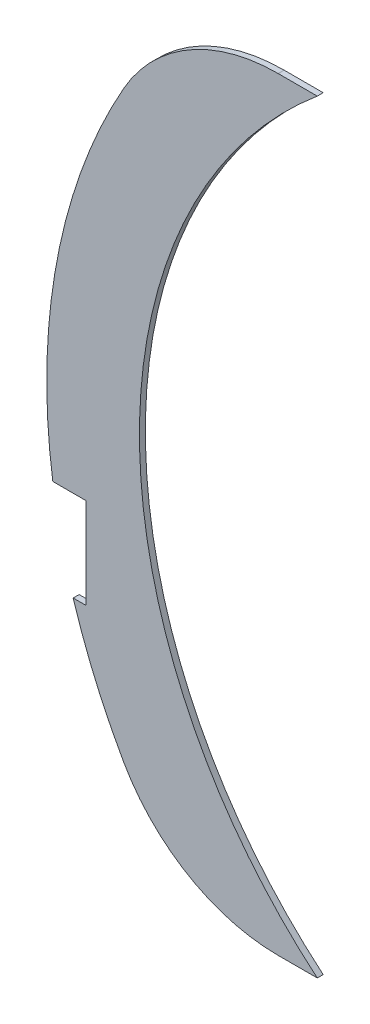
ISO-10303-21;
HEADER;
FILE_DESCRIPTION(('STEP AP214'),'2;1');
FILE_NAME('part.step','',(''),(''),'','','');
FILE_SCHEMA(('AUTOMOTIVE_DESIGN { 1 0 10303 214 1 1 1 1 }'));
ENDSEC;
DATA;
#1=APPLICATION_CONTEXT('core data for automotive mechanical design processes');
#2=APPLICATION_PROTOCOL_DEFINITION('international standard','automotive_design',2000,#1);
#3=PRODUCT_CONTEXT('',#1,'mechanical');
#4=PRODUCT('Part','Part','',(#3));
#5=PRODUCT_RELATED_PRODUCT_CATEGORY('part','',(#4));
#6=PRODUCT_DEFINITION_FORMATION('','',#4);
#7=PRODUCT_DEFINITION_CONTEXT('part definition',#1,'design');
#8=PRODUCT_DEFINITION('design','',#6,#7);
#9=PRODUCT_DEFINITION_SHAPE('','',#8);
#10=(LENGTH_UNIT() NAMED_UNIT(*) SI_UNIT(.MILLI.,.METRE.));
#11=(NAMED_UNIT(*) PLANE_ANGLE_UNIT() SI_UNIT($,.RADIAN.));
#12=(NAMED_UNIT(*) SI_UNIT($,.STERADIAN.) SOLID_ANGLE_UNIT());
#13=UNCERTAINTY_MEASURE_WITH_UNIT(LENGTH_MEASURE(1.E-05),#10,'distance_accuracy_value','');
#14=(GEOMETRIC_REPRESENTATION_CONTEXT(3) GLOBAL_UNCERTAINTY_ASSIGNED_CONTEXT((#13)) GLOBAL_UNIT_ASSIGNED_CONTEXT((#10,
#11,#12)) REPRESENTATION_CONTEXT('',''));
#15=CARTESIAN_POINT('',(0.,0.,0.));
#16=DIRECTION('',(0.,0.,1.));
#17=DIRECTION('',(1.,0.,0.));
#18=AXIS2_PLACEMENT_3D('',#15,#16,#17);
#19=CARTESIAN_POINT('',(0.,250.000000000001,-3.00000000000034));
#20=DIRECTION('',(0.,0.,0.999999999999999));
#21=DIRECTION('',(1.,0.,0.));
#22=AXIS2_PLACEMENT_3D('',#19,#20,#21);
#23=CYLINDRICAL_SURFACE('',#22,300.);
#24=DIRECTION('',(0.,0.,0.999999999999999));
#25=VECTOR('',#24,1.);
#26=CARTESIAN_POINT('',(-296.952939921013,207.350832689631,-2.99999999999995));
#27=LINE('',#26,#25);
#28=CARTESIAN_POINT('',(-296.952939921013,207.350832689631,0.));
#29=VERTEX_POINT('',#28);
#30=CARTESIAN_POINT('',(-296.952939921013,207.350832689631,-2.99999999999995));
#31=VERTEX_POINT('',#30);
#32=EDGE_CURVE('E188',#29,#31,#27,.F.);
#33=ORIENTED_EDGE('',*,*,#32,.F.);
#34=CARTESIAN_POINT('',(0.,250.000000000001,-3.33066907387547E-13));
#35=DIRECTION('',(0.,0.,0.999999999999999));
#36=DIRECTION('',(1.,0.,0.));
#37=AXIS2_PLACEMENT_3D('',#34,#35,#36);
#38=CIRCLE('',#37,300.);
#39=CARTESIAN_POINT('',(-260.9122540589,398.070239014817,0.));
#40=VERTEX_POINT('',#39);
#41=EDGE_CURVE('E147',#40,#29,#38,.T.);
#42=ORIENTED_EDGE('',*,*,#41,.F.);
#43=DIRECTION('',(0.,0.,0.999999999999999));
#44=VECTOR('',#43,1.);
#45=CARTESIAN_POINT('',(-260.9122540589,398.070239014817,-3.));
#46=LINE('',#45,#44);
#47=CARTESIAN_POINT('',(-260.9122540589,398.070239014817,-3.));
#48=VERTEX_POINT('',#47);
#49=EDGE_CURVE('E156',#48,#40,#46,.T.);
#50=ORIENTED_EDGE('',*,*,#49,.F.);
#51=CARTESIAN_POINT('',(0.,250.000000000001,-3.00000000000034));
#52=DIRECTION('',(0.,0.,0.999999999999999));
#53=DIRECTION('',(1.,0.,0.));
#54=AXIS2_PLACEMENT_3D('',#51,#52,#53);
#55=CIRCLE('',#54,300.);
#56=EDGE_CURVE('E194',#48,#31,#55,.T.);
#57=ORIENTED_EDGE('',*,*,#56,.T.);
#58=EDGE_LOOP('',(#33,#42,#50,#57));
#59=FACE_BOUND('',#58,.T.);
#60=ADVANCED_FACE('F49',(#59),#23,.T.);
#61=CARTESIAN_POINT('',(-158.11388300842,56.3508326896298,-3.));
#62=DIRECTION('',(0.,-1.,0.));
#63=DIRECTION('',(0.,0.,-0.999999999999999));
#64=AXIS2_PLACEMENT_3D('',#61,#62,#63);
#65=PLANE('',#64);
#66=DIRECTION('',(0.,0.,1.));
#67=VECTOR('',#66,1.);
#68=CARTESIAN_POINT('',(-162.815846894582,56.3508326896288,-10.));
#69=LINE('',#68,#67);
#70=CARTESIAN_POINT('',(-162.815846894582,56.3508326896297,0.));
#71=VERTEX_POINT('',#70);
#72=CARTESIAN_POINT('',(-162.815846894583,56.3508326896293,-3.00000000000034));
#73=VERTEX_POINT('',#72);
#74=EDGE_CURVE('E125',#71,#73,#69,.F.);
#75=ORIENTED_EDGE('',*,*,#74,.F.);
#76=DIRECTION('',(1.,0.,0.));
#77=VECTOR('',#76,1.);
#78=CARTESIAN_POINT('',(-158.11388300842,56.3508326896298,0.));
#79=LINE('',#78,#77);
#80=CARTESIAN_POINT('',(-182.63857784123,56.3508326896293,0.));
#81=VERTEX_POINT('',#80);
#82=EDGE_CURVE('E134',#81,#71,#79,.T.);
#83=ORIENTED_EDGE('',*,*,#82,.F.);
#84=DIRECTION('',(0.,0.,0.999999999999999));
#85=VECTOR('',#84,1.);
#86=CARTESIAN_POINT('',(-182.63857784123,56.3508326896293,-3.));
#87=LINE('',#86,#85);
#88=CARTESIAN_POINT('',(-182.63857784123,56.3508326896293,-3.));
#89=VERTEX_POINT('',#88);
#90=EDGE_CURVE('E151',#89,#81,#87,.T.);
#91=ORIENTED_EDGE('',*,*,#90,.F.);
#92=DIRECTION('',(1.,0.,0.));
#93=VECTOR('',#92,1.);
#94=CARTESIAN_POINT('',(-158.11388300842,56.3508326896298,-3.));
#95=LINE('',#94,#93);
#96=EDGE_CURVE('E136',#89,#73,#95,.T.);
#97=ORIENTED_EDGE('',*,*,#96,.T.);
#98=EDGE_LOOP('',(#75,#83,#91,#97));
#99=FACE_BOUND('',#98,.T.);
#100=ADVANCED_FACE('F133',(#99),#65,.T.);
#101=CARTESIAN_POINT('',(-182.63857784123,146.350832689629,-3.));
#102=DIRECTION('',(0.,0.,0.999999999999999));
#103=DIRECTION('',(1.,0.,0.));
#104=AXIS2_PLACEMENT_3D('',#101,#102,#103);
#105=CYLINDRICAL_SURFACE('',#104,90.);
#106=CARTESIAN_POINT('',(-182.63857784123,146.350832689629,0.));
#107=DIRECTION('',(0.,0.,0.999999999999999));
#108=DIRECTION('',(1.,0.,0.));
#109=AXIS2_PLACEMENT_3D('',#106,#107,#108);
#110=CIRCLE('',#109,90.);
#111=CARTESIAN_POINT('',(-260.9122540589,101.929760985185,-3.33066907387547E-13));
#112=VERTEX_POINT('',#111);
#113=EDGE_CURVE('E142',#112,#81,#110,.T.);
#114=ORIENTED_EDGE('',*,*,#113,.F.);
#115=DIRECTION('',(0.,0.,0.999999999999999));
#116=VECTOR('',#115,1.);
#117=CARTESIAN_POINT('',(-260.9122540589,101.929760985185,-3.00000000000034));
#118=LINE('',#117,#116);
#119=CARTESIAN_POINT('',(-260.9122540589,101.929760985185,-3.00000000000034));
#120=VERTEX_POINT('',#119);
#121=EDGE_CURVE('E153',#120,#112,#118,.T.);
#122=ORIENTED_EDGE('',*,*,#121,.F.);
#123=CARTESIAN_POINT('',(-182.63857784123,146.350832689629,-3.));
#124=DIRECTION('',(0.,0.,0.999999999999999));
#125=DIRECTION('',(1.,0.,0.));
#126=AXIS2_PLACEMENT_3D('',#123,#124,#125);
#127=CIRCLE('',#126,90.);
#128=EDGE_CURVE('E197',#120,#89,#127,.T.);
#129=ORIENTED_EDGE('',*,*,#128,.T.);
#130=ORIENTED_EDGE('',*,*,#90,.T.);
#131=EDGE_LOOP('',(#114,#122,#129,#130));
#132=FACE_BOUND('',#131,.T.);
#133=ADVANCED_FACE('F212',(#132),#105,.T.);
#134=DIRECTION('',(0.,0.,0.999999999999999));
#135=VECTOR('',#134,1.);
#136=CARTESIAN_POINT('',(-286.603079423754,161.35083268963,-3.00000000000034));
#137=LINE('',#136,#135);
#138=CARTESIAN_POINT('',(-286.603079423754,161.35083268963,-3.00000000000034));
#139=VERTEX_POINT('',#138);
#140=CARTESIAN_POINT('',(-286.603079423754,161.35083268963,-3.33066907387547E-13));
#141=VERTEX_POINT('',#140);
#142=EDGE_CURVE('E71',#139,#141,#137,.T.);
#143=ORIENTED_EDGE('',*,*,#142,.F.);
#144=EDGE_CURVE('E193',#139,#120,#55,.T.);
#145=ORIENTED_EDGE('',*,*,#144,.T.);
#146=ORIENTED_EDGE('',*,*,#121,.T.);
#147=EDGE_CURVE('E204',#141,#112,#38,.T.);
#148=ORIENTED_EDGE('',*,*,#147,.F.);
#149=EDGE_LOOP('',(#143,#145,#146,#148));
#150=FACE_BOUND('',#149,.T.);
#151=ADVANCED_FACE('F208',(#150),#23,.T.);
#152=CARTESIAN_POINT('',(-182.63857784123,353.649167310372,-2.99999999999995));
#153=DIRECTION('',(0.,0.,0.999999999999999));
#154=DIRECTION('',(1.,0.,0.));
#155=AXIS2_PLACEMENT_3D('',#152,#153,#154);
#156=CYLINDRICAL_SURFACE('',#155,90.);
#157=CARTESIAN_POINT('',(-182.63857784123,353.649167310372,3.33066907387547E-13));
#158=DIRECTION('',(0.,0.,0.999999999999999));
#159=DIRECTION('',(-1.,0.,0.));
#160=AXIS2_PLACEMENT_3D('',#157,#158,#159);
#161=CIRCLE('',#160,90.);
#162=CARTESIAN_POINT('',(-182.63857784123,443.649167310373,3.33066907387547E-13));
#163=VERTEX_POINT('',#162);
#164=EDGE_CURVE('E202',#163,#40,#161,.T.);
#165=ORIENTED_EDGE('',*,*,#164,.F.);
#166=DIRECTION('',(0.,0.,0.999999999999999));
#167=VECTOR('',#166,1.);
#168=CARTESIAN_POINT('',(-182.63857784123,443.649167310373,-2.99999999999967));
#169=LINE('',#168,#167);
#170=CARTESIAN_POINT('',(-182.63857784123,443.649167310373,-2.99999999999967));
#171=VERTEX_POINT('',#170);
#172=EDGE_CURVE('E158',#171,#163,#169,.T.);
#173=ORIENTED_EDGE('',*,*,#172,.F.);
#174=CARTESIAN_POINT('',(-182.63857784123,353.649167310372,-2.99999999999995));
#175=DIRECTION('',(0.,0.,0.999999999999999));
#176=DIRECTION('',(-1.,0.,0.));
#177=AXIS2_PLACEMENT_3D('',#174,#175,#176);
#178=CIRCLE('',#177,90.);
#179=EDGE_CURVE('E145',#171,#48,#178,.T.);
#180=ORIENTED_EDGE('',*,*,#179,.T.);
#181=ORIENTED_EDGE('',*,*,#49,.T.);
#182=EDGE_LOOP('',(#165,#173,#180,#181));
#183=FACE_BOUND('',#182,.T.);
#184=ADVANCED_FACE('F223',(#183),#156,.T.);
#185=CARTESIAN_POINT('',(-158.11388300842,443.649167310372,-2.99999999999967));
#186=DIRECTION('',(0.,1.,0.));
#187=DIRECTION('',(0.,0.,0.999999999999999));
#188=AXIS2_PLACEMENT_3D('',#185,#186,#187);
#189=PLANE('',#188);
#190=DIRECTION('',(0.,0.,1.));
#191=VECTOR('',#190,1.);
#192=CARTESIAN_POINT('',(-162.815846894583,443.649167310373,-10.));
#193=LINE('',#192,#191);
#194=CARTESIAN_POINT('',(-162.815846894583,443.649167310373,-3.00000000000034));
#195=VERTEX_POINT('',#194);
#196=CARTESIAN_POINT('',(-162.815846894583,443.649167310373,-3.33066907387547E-13));
#197=VERTEX_POINT('',#196);
#198=EDGE_CURVE('E63',#195,#197,#193,.T.);
#199=ORIENTED_EDGE('',*,*,#198,.F.);
#200=DIRECTION('',(-1.,0.,0.));
#201=VECTOR('',#200,1.);
#202=CARTESIAN_POINT('',(-158.11388300842,443.649167310372,-2.99999999999967));
#203=LINE('',#202,#201);
#204=EDGE_CURVE('E143',#195,#171,#203,.T.);
#205=ORIENTED_EDGE('',*,*,#204,.T.);
#206=ORIENTED_EDGE('',*,*,#172,.T.);
#207=DIRECTION('',(-1.,0.,0.));
#208=VECTOR('',#207,1.);
#209=CARTESIAN_POINT('',(-158.11388300842,443.649167310372,3.33066907387547E-13));
#210=LINE('',#209,#208);
#211=EDGE_CURVE('E189',#197,#163,#210,.T.);
#212=ORIENTED_EDGE('',*,*,#211,.F.);
#213=EDGE_LOOP('',(#199,#205,#206,#212));
#214=FACE_BOUND('',#213,.T.);
#215=ADVANCED_FACE('F51',(#214),#189,.T.);
#216=CARTESIAN_POINT('',(0.,250.000000000001,-3.00000000000034));
#217=DIRECTION('',(0.,0.,0.999999999999999));
#218=DIRECTION('',(1.,0.,0.));
#219=AXIS2_PLACEMENT_3D('',#216,#217,#218);
#220=PLANE('',#219);
#221=ORIENTED_EDGE('',*,*,#204,.F.);
#222=CARTESIAN_POINT('',(0.,250.000000000001,-3.00000000000034));
#223=DIRECTION('',(0.,0.,0.999999999999999));
#224=DIRECTION('',(1.,0.,0.));
#225=AXIS2_PLACEMENT_3D('',#222,#223,#224);
#226=CIRCLE('',#225,253.000000000001);
#227=EDGE_CURVE('E216',#195,#73,#226,.T.);
#228=ORIENTED_EDGE('',*,*,#227,.T.);
#229=ORIENTED_EDGE('',*,*,#96,.F.);
#230=ORIENTED_EDGE('',*,*,#128,.F.);
#231=ORIENTED_EDGE('',*,*,#144,.F.);
#232=DIRECTION('',(1.,0.,0.));
#233=VECTOR('',#232,1.);
#234=CARTESIAN_POINT('',(7.7715611723761E-13,161.35083268963,-3.00000000000034));
#235=LINE('',#234,#233);
#236=CARTESIAN_POINT('',(-280.000000000001,161.35083268963,-3.00000000000034));
#237=VERTEX_POINT('',#236);
#238=EDGE_CURVE('E178',#139,#237,#235,.T.);
#239=ORIENTED_EDGE('',*,*,#238,.T.);
#240=DIRECTION('',(0.,1.,0.));
#241=VECTOR('',#240,1.);
#242=CARTESIAN_POINT('',(-280.000000000001,250.000000000001,-3.00000000000028));
#243=LINE('',#242,#241);
#244=CARTESIAN_POINT('',(-280.000000000001,207.350832689631,-3.00000000000034));
#245=VERTEX_POINT('',#244);
#246=EDGE_CURVE('E182',#237,#245,#243,.T.);
#247=ORIENTED_EDGE('',*,*,#246,.T.);
#248=DIRECTION('',(-1.,0.,0.));
#249=VECTOR('',#248,1.);
#250=CARTESIAN_POINT('',(1.11022302462516E-13,207.35083268963,-3.00000000000034));
#251=LINE('',#250,#249);
#252=EDGE_CURVE('E185',#245,#31,#251,.T.);
#253=ORIENTED_EDGE('',*,*,#252,.T.);
#254=ORIENTED_EDGE('',*,*,#56,.F.);
#255=ORIENTED_EDGE('',*,*,#179,.F.);
#256=EDGE_LOOP('',(#221,#228,#229,#230,#231,#239,#247,#253,#254,#255));
#257=FACE_BOUND('',#256,.T.);
#258=ADVANCED_FACE('F215',(#257),#220,.F.);
#259=CARTESIAN_POINT('',(0.,250.000000000001,-3.33066907387547E-13));
#260=DIRECTION('',(0.,0.,0.999999999999999));
#261=DIRECTION('',(1.,0.,0.));
#262=AXIS2_PLACEMENT_3D('',#259,#260,#261);
#263=PLANE('',#262);
#264=CARTESIAN_POINT('',(0.,250.000000000001,-3.33066907387547E-13));
#265=DIRECTION('',(0.,0.,0.999999999999999));
#266=DIRECTION('',(1.,0.,0.));
#267=AXIS2_PLACEMENT_3D('',#264,#265,#266);
#268=CIRCLE('',#267,253.000000000001);
#269=EDGE_CURVE('E13',#197,#71,#268,.T.);
#270=ORIENTED_EDGE('',*,*,#269,.F.);
#271=ORIENTED_EDGE('',*,*,#211,.T.);
#272=ORIENTED_EDGE('',*,*,#164,.T.);
#273=ORIENTED_EDGE('',*,*,#41,.T.);
#274=DIRECTION('',(-1.,0.,0.));
#275=VECTOR('',#274,1.);
#276=CARTESIAN_POINT('',(-338.045623223308,207.350832689631,0.));
#277=LINE('',#276,#275);
#278=CARTESIAN_POINT('',(-280.000000000001,207.350832689631,-3.33066907387547E-13));
#279=VERTEX_POINT('',#278);
#280=EDGE_CURVE('E169',#279,#29,#277,.T.);
#281=ORIENTED_EDGE('',*,*,#280,.F.);
#282=DIRECTION('',(0.,1.,0.));
#283=VECTOR('',#282,1.);
#284=CARTESIAN_POINT('',(-280.000000000001,207.350832689631,-3.33066907387547E-13));
#285=LINE('',#284,#283);
#286=CARTESIAN_POINT('',(-280.000000000001,161.35083268963,-3.33066907387547E-13));
#287=VERTEX_POINT('',#286);
#288=EDGE_CURVE('E137',#287,#279,#285,.T.);
#289=ORIENTED_EDGE('',*,*,#288,.F.);
#290=DIRECTION('',(1.,0.,0.));
#291=VECTOR('',#290,1.);
#292=CARTESIAN_POINT('',(8.88178419700125E-13,161.35083268963,-3.33066907387547E-13));
#293=LINE('',#292,#291);
#294=EDGE_CURVE('E57',#141,#287,#293,.T.);
#295=ORIENTED_EDGE('',*,*,#294,.F.);
#296=ORIENTED_EDGE('',*,*,#147,.T.);
#297=ORIENTED_EDGE('',*,*,#113,.T.);
#298=ORIENTED_EDGE('',*,*,#82,.T.);
#299=EDGE_LOOP('',(#270,#271,#272,#273,#281,#289,#295,#296,#297,#298));
#300=FACE_BOUND('',#299,.T.);
#301=ADVANCED_FACE('F140',(#300),#263,.T.);
#302=CARTESIAN_POINT('',(-280.000000000001,207.350832689631,-10.0000000000003));
#303=DIRECTION('',(1.,0.,0.));
#304=DIRECTION('',(0.,0.,-0.999999999999999));
#305=AXIS2_PLACEMENT_3D('',#302,#303,#304);
#306=PLANE('',#305);
#307=DIRECTION('',(0.,0.,0.999999999999999));
#308=VECTOR('',#307,1.);
#309=CARTESIAN_POINT('',(-280.000000000001,161.35083268963,-10.0000000000003));
#310=LINE('',#309,#308);
#311=EDGE_CURVE('E163',#237,#287,#310,.T.);
#312=ORIENTED_EDGE('',*,*,#311,.T.);
#313=ORIENTED_EDGE('',*,*,#288,.T.);
#314=DIRECTION('',(0.,0.,0.999999999999999));
#315=VECTOR('',#314,1.);
#316=CARTESIAN_POINT('',(-280.000000000001,207.350832689631,-10.0000000000003));
#317=LINE('',#316,#315);
#318=EDGE_CURVE('E176',#245,#279,#317,.T.);
#319=ORIENTED_EDGE('',*,*,#318,.F.);
#320=ORIENTED_EDGE('',*,*,#246,.F.);
#321=EDGE_LOOP('',(#312,#313,#319,#320));
#322=FACE_BOUND('',#321,.T.);
#323=ADVANCED_FACE('F229',(#322),#306,.F.);
#324=CARTESIAN_POINT('',(-338.045623223308,207.350832689631,-10.));
#325=DIRECTION('',(0.,1.,0.));
#326=DIRECTION('',(0.,0.,0.999999999999999));
#327=AXIS2_PLACEMENT_3D('',#324,#325,#326);
#328=PLANE('',#327);
#329=ORIENTED_EDGE('',*,*,#32,.T.);
#330=ORIENTED_EDGE('',*,*,#252,.F.);
#331=ORIENTED_EDGE('',*,*,#318,.T.);
#332=ORIENTED_EDGE('',*,*,#280,.T.);
#333=EDGE_LOOP('',(#329,#330,#331,#332));
#334=FACE_BOUND('',#333,.T.);
#335=ADVANCED_FACE('F228',(#334),#328,.F.);
#336=CARTESIAN_POINT('',(-338.045623223308,161.35083268963,-10.));
#337=DIRECTION('',(0.,-1.,0.));
#338=DIRECTION('',(0.,0.,-0.999999999999999));
#339=AXIS2_PLACEMENT_3D('',#336,#337,#338);
#340=PLANE('',#339);
#341=ORIENTED_EDGE('',*,*,#142,.T.);
#342=ORIENTED_EDGE('',*,*,#294,.T.);
#343=ORIENTED_EDGE('',*,*,#311,.F.);
#344=ORIENTED_EDGE('',*,*,#238,.F.);
#345=EDGE_LOOP('',(#341,#342,#343,#344));
#346=FACE_BOUND('',#345,.T.);
#347=ADVANCED_FACE('F162',(#346),#340,.F.);
#348=CARTESIAN_POINT('',(0.,250.000000000001,-10.));
#349=DIRECTION('',(0.,0.,1.));
#350=DIRECTION('',(1.,0.,0.));
#351=AXIS2_PLACEMENT_3D('',#348,#349,#350);
#352=CYLINDRICAL_SURFACE('',#351,253.000000000001);
#353=ORIENTED_EDGE('',*,*,#74,.T.);
#354=ORIENTED_EDGE('',*,*,#227,.F.);
#355=ORIENTED_EDGE('',*,*,#198,.T.);
#356=ORIENTED_EDGE('',*,*,#269,.T.);
#357=EDGE_LOOP('',(#353,#354,#355,#356));
#358=FACE_BOUND('',#357,.T.);
#359=ADVANCED_FACE('F124',(#358),#352,.F.);
#360=CLOSED_SHELL('',(#60,#100,#133,#151,#184,#215,#258,#301,#323,#335,#347,#359));
#361=MANIFOLD_SOLID_BREP('B2',#360);
#362=ADVANCED_BREP_SHAPE_REPRESENTATION('',(#18,#361),#14);
#363=SHAPE_DEFINITION_REPRESENTATION(#9,#362);
ENDSEC;
END-ISO-10303-21;
